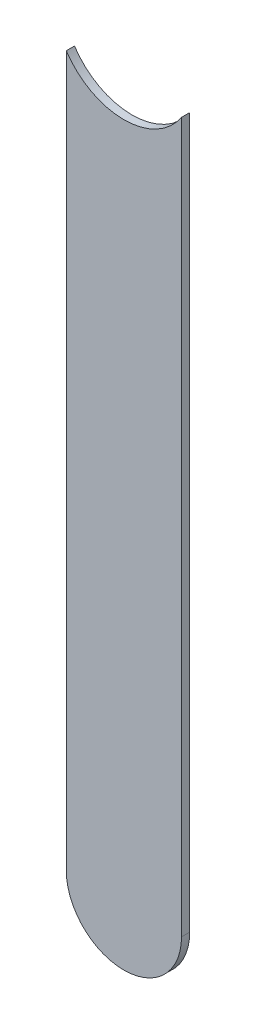
ISO-10303-21;
HEADER;
FILE_DESCRIPTION(('STEP AP214'),'2;1');
FILE_NAME('part.step','',(''),(''),'','','');
FILE_SCHEMA(('AUTOMOTIVE_DESIGN { 1 0 10303 214 1 1 1 1 }'));
ENDSEC;
DATA;
#1=APPLICATION_CONTEXT('core data for automotive mechanical design processes');
#2=APPLICATION_PROTOCOL_DEFINITION('international standard','automotive_design',2000,#1);
#3=PRODUCT_CONTEXT('',#1,'mechanical');
#4=PRODUCT('Part','Part','',(#3));
#5=PRODUCT_RELATED_PRODUCT_CATEGORY('part','',(#4));
#6=PRODUCT_DEFINITION_FORMATION('','',#4);
#7=PRODUCT_DEFINITION_CONTEXT('part definition',#1,'design');
#8=PRODUCT_DEFINITION('design','',#6,#7);
#9=PRODUCT_DEFINITION_SHAPE('','',#8);
#10=(LENGTH_UNIT() NAMED_UNIT(*) SI_UNIT(.MILLI.,.METRE.));
#11=(NAMED_UNIT(*) PLANE_ANGLE_UNIT() SI_UNIT($,.RADIAN.));
#12=(NAMED_UNIT(*) SI_UNIT($,.STERADIAN.) SOLID_ANGLE_UNIT());
#13=UNCERTAINTY_MEASURE_WITH_UNIT(LENGTH_MEASURE(1.E-05),#10,'distance_accuracy_value','');
#14=(GEOMETRIC_REPRESENTATION_CONTEXT(3) GLOBAL_UNCERTAINTY_ASSIGNED_CONTEXT((#13)) GLOBAL_UNIT_ASSIGNED_CONTEXT((#10,
#11,#12)) REPRESENTATION_CONTEXT('',''));
#15=CARTESIAN_POINT('',(0.,0.,0.));
#16=DIRECTION('',(0.,0.,1.));
#17=DIRECTION('',(1.,0.,0.));
#18=AXIS2_PLACEMENT_3D('',#15,#16,#17);
#19=CARTESIAN_POINT('',(110.7299919,101.0545604,0.));
#20=DIRECTION('',(-1.,0.,0.));
#21=DIRECTION('',(0.,1.,0.));
#22=AXIS2_PLACEMENT_3D('',#19,#20,#21);
#23=PLANE('',#22);
#24=DIRECTION('',(0.,1.,0.));
#25=VECTOR('',#24,1.);
#26=CARTESIAN_POINT('',(110.7299919,101.0545604,0.03556));
#27=LINE('',#26,#25);
#28=CARTESIAN_POINT('',(110.7299919,101.0545604,0.03556));
#29=VERTEX_POINT('',#28);
#30=CARTESIAN_POINT('',(110.7299919,104.134189092145,0.03556));
#31=VERTEX_POINT('',#30);
#32=EDGE_CURVE('E11',#29,#31,#27,.T.);
#33=ORIENTED_EDGE('',*,*,#32,.F.);
#34=DIRECTION('',(0.,0.,1.));
#35=VECTOR('',#34,1.);
#36=CARTESIAN_POINT('',(110.7299919,101.0545604,0.));
#37=LINE('',#36,#35);
#38=CARTESIAN_POINT('',(110.7299919,101.0545604,0.));
#39=VERTEX_POINT('',#38);
#40=EDGE_CURVE('E24',#39,#29,#37,.T.);
#41=ORIENTED_EDGE('',*,*,#40,.F.);
#42=DIRECTION('',(0.,1.,0.));
#43=VECTOR('',#42,1.);
#44=CARTESIAN_POINT('',(110.7299919,101.0545604,0.));
#45=LINE('',#44,#43);
#46=CARTESIAN_POINT('',(110.7299919,104.134189092145,0.));
#47=VERTEX_POINT('',#46);
#48=EDGE_CURVE('E75',#39,#47,#45,.T.);
#49=ORIENTED_EDGE('',*,*,#48,.T.);
#50=DIRECTION('',(0.,0.,1.));
#51=VECTOR('',#50,1.);
#52=CARTESIAN_POINT('',(110.7299919,104.134189092145,0.));
#53=LINE('',#52,#51);
#54=EDGE_CURVE('E37',#47,#31,#53,.T.);
#55=ORIENTED_EDGE('',*,*,#54,.T.);
#56=EDGE_LOOP('',(#33,#41,#49,#55));
#57=FACE_BOUND('',#56,.T.);
#58=ADVANCED_FACE('F17',(#57),#23,.F.);
#59=CARTESIAN_POINT('',(110.4799924,104.30002,0.));
#60=DIRECTION('',(0.,0.,-1.));
#61=DIRECTION('',(1.,0.,0.));
#62=AXIS2_PLACEMENT_3D('',#59,#60,#61);
#63=CYLINDRICAL_SURFACE('',#62,0.2999994);
#64=DIRECTION('',(0.,0.,1.));
#65=VECTOR('',#64,1.);
#66=CARTESIAN_POINT('',(110.2299929,104.134189092145,0.));
#67=LINE('',#66,#65);
#68=CARTESIAN_POINT('',(110.2299929,104.134189092145,0.));
#69=VERTEX_POINT('',#68);
#70=CARTESIAN_POINT('',(110.2299929,104.134189092145,0.03556));
#71=VERTEX_POINT('',#70);
#72=EDGE_CURVE('E67',#69,#71,#67,.T.);
#73=ORIENTED_EDGE('',*,*,#72,.T.);
#74=CARTESIAN_POINT('',(110.4799924,104.30002,0.03556));
#75=DIRECTION('',(0.,0.,1.));
#76=DIRECTION('',(1.,0.,0.));
#77=AXIS2_PLACEMENT_3D('',#74,#75,#76);
#78=CIRCLE('',#77,0.2999994);
#79=EDGE_CURVE('E82',#71,#31,#78,.T.);
#80=ORIENTED_EDGE('',*,*,#79,.T.);
#81=ORIENTED_EDGE('',*,*,#54,.F.);
#82=CARTESIAN_POINT('',(110.4799924,104.30002,0.));
#83=DIRECTION('',(0.,0.,1.));
#84=DIRECTION('',(1.,0.,0.));
#85=AXIS2_PLACEMENT_3D('',#82,#83,#84);
#86=CIRCLE('',#85,0.2999994);
#87=EDGE_CURVE('E80',#69,#47,#86,.T.);
#88=ORIENTED_EDGE('',*,*,#87,.F.);
#89=EDGE_LOOP('',(#73,#80,#81,#88));
#90=FACE_BOUND('',#89,.T.);
#91=ADVANCED_FACE('F88',(#90),#63,.F.);
#92=CARTESIAN_POINT('',(110.2299929,104.134189092145,0.));
#93=DIRECTION('',(1.,0.,0.));
#94=DIRECTION('',(0.,-1.,0.));
#95=AXIS2_PLACEMENT_3D('',#92,#93,#94);
#96=PLANE('',#95);
#97=DIRECTION('',(0.,-1.,0.));
#98=VECTOR('',#97,1.);
#99=CARTESIAN_POINT('',(110.2299929,104.30002,0.03556));
#100=LINE('',#99,#98);
#101=CARTESIAN_POINT('',(110.2299929,101.0545604,0.03556));
#102=VERTEX_POINT('',#101);
#103=EDGE_CURVE('E71',#71,#102,#100,.T.);
#104=ORIENTED_EDGE('',*,*,#103,.F.);
#105=ORIENTED_EDGE('',*,*,#72,.F.);
#106=DIRECTION('',(0.,-1.,0.));
#107=VECTOR('',#106,1.);
#108=CARTESIAN_POINT('',(110.2299929,104.30002,0.));
#109=LINE('',#108,#107);
#110=CARTESIAN_POINT('',(110.2299929,101.0545604,0.));
#111=VERTEX_POINT('',#110);
#112=EDGE_CURVE('E63',#69,#111,#109,.T.);
#113=ORIENTED_EDGE('',*,*,#112,.T.);
#114=DIRECTION('',(0.,0.,1.));
#115=VECTOR('',#114,1.);
#116=CARTESIAN_POINT('',(110.2299929,101.0545604,0.));
#117=LINE('',#116,#115);
#118=EDGE_CURVE('E53',#111,#102,#117,.T.);
#119=ORIENTED_EDGE('',*,*,#118,.T.);
#120=EDGE_LOOP('',(#104,#105,#113,#119));
#121=FACE_BOUND('',#120,.T.);
#122=ADVANCED_FACE('F66',(#121),#96,.F.);
#123=CARTESIAN_POINT('',(110.4799924,101.0545604,0.));
#124=DIRECTION('',(0.,0.,-1.));
#125=DIRECTION('',(-1.,0.,0.));
#126=AXIS2_PLACEMENT_3D('',#123,#124,#125);
#127=CYLINDRICAL_SURFACE('',#126,0.249999500000001);
#128=CARTESIAN_POINT('',(110.4799924,101.0545604,0.03556));
#129=DIRECTION('',(0.,0.,1.));
#130=DIRECTION('',(-1.,0.,0.));
#131=AXIS2_PLACEMENT_3D('',#128,#129,#130);
#132=CIRCLE('',#131,0.249999500000001);
#133=EDGE_CURVE('E59',#102,#29,#132,.T.);
#134=ORIENTED_EDGE('',*,*,#133,.F.);
#135=ORIENTED_EDGE('',*,*,#118,.F.);
#136=CARTESIAN_POINT('',(110.4799924,101.0545604,0.));
#137=DIRECTION('',(0.,0.,1.));
#138=DIRECTION('',(-1.,0.,0.));
#139=AXIS2_PLACEMENT_3D('',#136,#137,#138);
#140=CIRCLE('',#139,0.249999500000001);
#141=EDGE_CURVE('E57',#111,#39,#140,.T.);
#142=ORIENTED_EDGE('',*,*,#141,.T.);
#143=ORIENTED_EDGE('',*,*,#40,.T.);
#144=EDGE_LOOP('',(#134,#135,#142,#143));
#145=FACE_BOUND('',#144,.T.);
#146=ADVANCED_FACE('F55',(#145),#127,.T.);
#147=CARTESIAN_POINT('',(110.7299919,101.0545604,0.));
#148=DIRECTION('',(0.,0.,-1.));
#149=DIRECTION('',(-1.,0.,0.));
#150=AXIS2_PLACEMENT_3D('',#147,#148,#149);
#151=PLANE('',#150);
#152=ORIENTED_EDGE('',*,*,#48,.F.);
#153=ORIENTED_EDGE('',*,*,#141,.F.);
#154=ORIENTED_EDGE('',*,*,#112,.F.);
#155=ORIENTED_EDGE('',*,*,#87,.T.);
#156=EDGE_LOOP('',(#152,#153,#154,#155));
#157=FACE_BOUND('',#156,.T.);
#158=ADVANCED_FACE('F74',(#157),#151,.T.);
#159=CARTESIAN_POINT('',(110.7299919,101.0545604,0.03556));
#160=DIRECTION('',(0.,0.,-1.));
#161=DIRECTION('',(-1.,0.,0.));
#162=AXIS2_PLACEMENT_3D('',#159,#160,#161);
#163=PLANE('',#162);
#164=ORIENTED_EDGE('',*,*,#133,.T.);
#165=ORIENTED_EDGE('',*,*,#32,.T.);
#166=ORIENTED_EDGE('',*,*,#79,.F.);
#167=ORIENTED_EDGE('',*,*,#103,.T.);
#168=EDGE_LOOP('',(#164,#165,#166,#167));
#169=FACE_BOUND('',#168,.T.);
#170=ADVANCED_FACE('F91',(#169),#163,.F.);
#171=CLOSED_SHELL('',(#58,#91,#122,#146,#158,#170));
#172=MANIFOLD_SOLID_BREP('B1',#171);
#173=ADVANCED_BREP_SHAPE_REPRESENTATION('',(#18,#172),#14);
#174=SHAPE_DEFINITION_REPRESENTATION(#9,#173);
ENDSEC;
END-ISO-10303-21;
